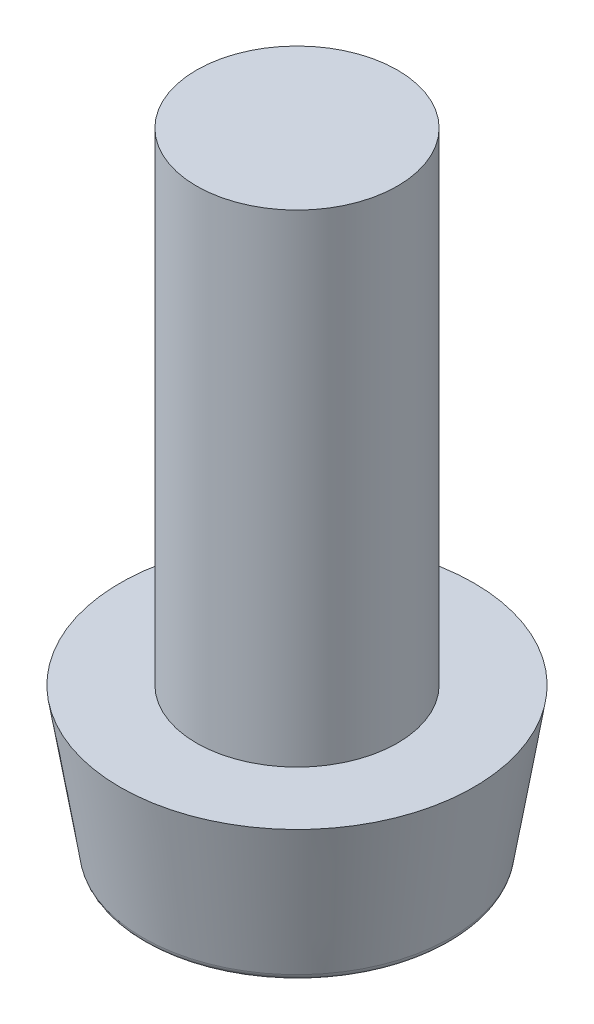
ISO-10303-21;
HEADER;
FILE_DESCRIPTION(('STEP AP214'),'2;1');
FILE_NAME('part.step','',(''),(''),'','','');
FILE_SCHEMA(('AUTOMOTIVE_DESIGN { 1 0 10303 214 1 1 1 1 }'));
ENDSEC;
DATA;
#1=APPLICATION_CONTEXT('core data for automotive mechanical design processes');
#2=APPLICATION_PROTOCOL_DEFINITION('international standard','automotive_design',2000,#1);
#3=PRODUCT_CONTEXT('',#1,'mechanical');
#4=PRODUCT('Part','Part','',(#3));
#5=PRODUCT_RELATED_PRODUCT_CATEGORY('part','',(#4));
#6=PRODUCT_DEFINITION_FORMATION('','',#4);
#7=PRODUCT_DEFINITION_CONTEXT('part definition',#1,'design');
#8=PRODUCT_DEFINITION('design','',#6,#7);
#9=PRODUCT_DEFINITION_SHAPE('','',#8);
#10=(LENGTH_UNIT() NAMED_UNIT(*) SI_UNIT(.MILLI.,.METRE.));
#11=(NAMED_UNIT(*) PLANE_ANGLE_UNIT() SI_UNIT($,.RADIAN.));
#12=(NAMED_UNIT(*) SI_UNIT($,.STERADIAN.) SOLID_ANGLE_UNIT());
#13=UNCERTAINTY_MEASURE_WITH_UNIT(LENGTH_MEASURE(1.E-05),#10,'distance_accuracy_value','');
#14=(GEOMETRIC_REPRESENTATION_CONTEXT(3) GLOBAL_UNCERTAINTY_ASSIGNED_CONTEXT((#13)) GLOBAL_UNIT_ASSIGNED_CONTEXT((#10,
#11,#12)) REPRESENTATION_CONTEXT('',''));
#15=CARTESIAN_POINT('',(0.,0.,0.));
#16=DIRECTION('',(0.,0.,1.));
#17=DIRECTION('',(1.,0.,0.));
#18=AXIS2_PLACEMENT_3D('',#15,#16,#17);
#19=CARTESIAN_POINT('',(0.,1.85,0.));
#20=DIRECTION('',(0.,1.,0.));
#21=DIRECTION('',(0.,0.,1.));
#22=AXIS2_PLACEMENT_3D('',#19,#20,#21);
#23=PLANE('',#22);
#24=CARTESIAN_POINT('',(0.,1.85,0.));
#25=DIRECTION('',(0.,1.,0.));
#26=DIRECTION('',(0.,0.,1.));
#27=AXIS2_PLACEMENT_3D('',#24,#25,#26);
#28=CIRCLE('',#27,1.25);
#29=CARTESIAN_POINT('',(0.,1.85,1.25));
#30=VERTEX_POINT('',#29);
#31=EDGE_CURVE('E50',#30,#30,#28,.T.);
#32=ORIENTED_EDGE('',*,*,#31,.F.);
#33=EDGE_LOOP('',(#32));
#34=FACE_BOUND('',#33,.T.);
#35=CARTESIAN_POINT('',(0.,1.85,0.));
#36=DIRECTION('',(0.,1.,0.));
#37=DIRECTION('',(0.,0.,1.));
#38=AXIS2_PLACEMENT_3D('',#35,#36,#37);
#39=CIRCLE('',#38,2.19999999999999);
#40=CARTESIAN_POINT('',(0.,1.85,2.19999999999999));
#41=VERTEX_POINT('',#40);
#42=EDGE_CURVE('E55',#41,#41,#39,.T.);
#43=ORIENTED_EDGE('',*,*,#42,.T.);
#44=EDGE_LOOP('',(#43));
#45=FACE_BOUND('',#44,.T.);
#46=ADVANCED_FACE('F37',(#34,#45),#23,.T.);
#47=CARTESIAN_POINT('',(0.,0.,0.));
#48=DIRECTION('',(0.,1.,0.));
#49=DIRECTION('',(0.,0.,1.));
#50=AXIS2_PLACEMENT_3D('',#47,#48,#49);
#51=PLANE('',#50);
#52=CARTESIAN_POINT('',(0.,0.,0.));
#53=DIRECTION('',(0.,1.,0.));
#54=DIRECTION('',(0.,0.,1.));
#55=AXIS2_PLACEMENT_3D('',#52,#53,#54);
#56=CIRCLE('',#55,1.81490991992437);
#57=CARTESIAN_POINT('',(0.,0.,1.81490991992437));
#58=VERTEX_POINT('',#57);
#59=EDGE_CURVE('E45',#58,#58,#56,.F.);
#60=ORIENTED_EDGE('',*,*,#59,.T.);
#61=EDGE_LOOP('',(#60));
#62=FACE_BOUND('',#61,.T.);
#63=ADVANCED_FACE('F71',(#62),#51,.F.);
#64=CARTESIAN_POINT('',(0.,7.85,0.));
#65=DIRECTION('',(0.,-1.,0.));
#66=DIRECTION('',(0.,0.,-1.));
#67=AXIS2_PLACEMENT_3D('',#64,#65,#66);
#68=CYLINDRICAL_SURFACE('',#67,1.25);
#69=CARTESIAN_POINT('',(0.,7.85,0.));
#70=DIRECTION('',(0.,1.,0.));
#71=DIRECTION('',(0.,0.,1.));
#72=AXIS2_PLACEMENT_3D('',#69,#70,#71);
#73=CIRCLE('',#72,1.25);
#74=CARTESIAN_POINT('',(0.,7.85,1.25));
#75=VERTEX_POINT('',#74);
#76=EDGE_CURVE('E60',#75,#75,#73,.T.);
#77=ORIENTED_EDGE('',*,*,#76,.F.);
#78=EDGE_LOOP('',(#77));
#79=FACE_BOUND('',#78,.T.);
#80=ORIENTED_EDGE('',*,*,#31,.T.);
#81=EDGE_LOOP('',(#80));
#82=FACE_BOUND('',#81,.T.);
#83=ADVANCED_FACE('F68',(#79,#82),#68,.T.);
#84=CARTESIAN_POINT('',(0.,7.85,0.));
#85=DIRECTION('',(0.,1.,0.));
#86=DIRECTION('',(0.,0.,1.));
#87=AXIS2_PLACEMENT_3D('',#84,#85,#86);
#88=PLANE('',#87);
#89=ORIENTED_EDGE('',*,*,#76,.T.);
#90=EDGE_LOOP('',(#89));
#91=FACE_BOUND('',#90,.T.);
#92=ADVANCED_FACE('F66',(#91),#88,.T.);
#93=CARTESIAN_POINT('',(0.,1.85000000000001,0.));
#94=DIRECTION('',(0.,1.,0.));
#95=DIRECTION('',(0.,0.,1.));
#96=AXIS2_PLACEMENT_3D('',#93,#94,#95);
#97=CONICAL_SURFACE('',#96,2.19999999999999,0.160762740625832);
#98=CARTESIAN_POINT('',(0.,0.0839928841446341,0.));
#99=DIRECTION('',(0.,1.,0.));
#100=DIRECTION('',(0.,0.,1.));
#101=AXIS2_PLACEMENT_3D('',#98,#99,#100);
#102=CIRCLE('',#101,1.91362046769913);
#103=CARTESIAN_POINT('',(0.,0.0839928841446342,1.91362046769913));
#104=VERTEX_POINT('',#103);
#105=EDGE_CURVE('E10',#104,#104,#102,.T.);
#106=CARTESIAN_POINT('',(0.,0.0839928841446342,1.91362046769913));
#107=CARTESIAN_POINT('',(0.,0.102388791601461,1.91660358782726));
#108=CARTESIAN_POINT('',(0.,0.120784699058288,1.91958670795539));
#109=CARTESIAN_POINT('',(0.,0.157576513971941,1.92555294821166));
#110=CARTESIAN_POINT('',(0.,0.175972421428768,1.9285360683398));
#111=CARTESIAN_POINT('',(0.,0.212764236342421,1.93450230859607));
#112=CARTESIAN_POINT('',(0.,0.231160143799248,1.9374854287242));
#113=CARTESIAN_POINT('',(0.,0.267951958712902,1.94345166898047));
#114=CARTESIAN_POINT('',(0.,0.286347866169728,1.9464347891086));
#115=CARTESIAN_POINT('',(0.,0.323139681083382,1.95240102936487));
#116=CARTESIAN_POINT('',(0.,0.341535588540208,1.955384149493));
#117=CARTESIAN_POINT('',(0.,0.378327403453862,1.96135038974927));
#118=CARTESIAN_POINT('',(0.,0.396723310910689,1.96433350987741));
#119=CARTESIAN_POINT('',(0.,0.433515125824342,1.97029975013367));
#120=CARTESIAN_POINT('',(0.,0.451911033281169,1.97328287026181));
#121=CARTESIAN_POINT('',(0.,0.488702848194822,1.97924911051807));
#122=CARTESIAN_POINT('',(0.,0.507098755651649,1.98223223064621));
#123=CARTESIAN_POINT('',(0.,0.543890570565302,1.98819847090248));
#124=CARTESIAN_POINT('',(0.,0.562286478022129,1.99118159103061));
#125=CARTESIAN_POINT('',(0.,0.599078292935783,1.99714783128688));
#126=CARTESIAN_POINT('',(0.,0.617474200392609,2.00013095141501));
#127=CARTESIAN_POINT('',(0.,0.654266015306263,2.00609719167128));
#128=CARTESIAN_POINT('',(0.,0.672661922763089,2.00908031179942));
#129=CARTESIAN_POINT('',(0.,0.709453737676743,2.01504655205568));
#130=CARTESIAN_POINT('',(0.,0.72784964513357,2.01802967218382));
#131=CARTESIAN_POINT('',(0.,0.764641460047223,2.02399591244009));
#132=CARTESIAN_POINT('',(0.,0.78303736750405,2.02697903256822));
#133=CARTESIAN_POINT('',(0.,0.819829182417703,2.03294527282449));
#134=CARTESIAN_POINT('',(0.,0.83822508987453,2.03592839295262));
#135=CARTESIAN_POINT('',(0.,0.875016904788184,2.04189463320889));
#136=CARTESIAN_POINT('',(0.,0.89341281224501,2.04487775333702));
#137=CARTESIAN_POINT('',(0.,0.930204627158664,2.05084399359329));
#138=CARTESIAN_POINT('',(0.,0.94860053461549,2.05382711372143));
#139=CARTESIAN_POINT('',(0.,0.985392349529144,2.05979335397769));
#140=CARTESIAN_POINT('',(0.,1.00378825698597,2.06277647410583));
#141=CARTESIAN_POINT('',(0.,1.04058007189962,2.0687427143621));
#142=CARTESIAN_POINT('',(0.,1.05897597935645,2.07172583449023));
#143=CARTESIAN_POINT('',(0.,1.0957677942701,2.0776920747465));
#144=CARTESIAN_POINT('',(0.,1.11416370172693,2.08067519487463));
#145=CARTESIAN_POINT('',(0.,1.15095551664058,2.0866414351309));
#146=CARTESIAN_POINT('',(0.,1.16935142409741,2.08962455525903));
#147=CARTESIAN_POINT('',(0.,1.20614323901106,2.0955907955153));
#148=CARTESIAN_POINT('',(0.,1.22453914646789,2.09857391564344));
#149=CARTESIAN_POINT('',(0.,1.26133096138154,2.1045401558997));
#150=CARTESIAN_POINT('',(0.,1.27972686883837,2.10752327602784));
#151=CARTESIAN_POINT('',(0.,1.31651868375202,2.11348951628411));
#152=CARTESIAN_POINT('',(0.,1.33491459120885,2.11647263641224));
#153=CARTESIAN_POINT('',(0.,1.3717064061225,2.12243887666851));
#154=CARTESIAN_POINT('',(0.,1.39010231357933,2.12542199679664));
#155=CARTESIAN_POINT('',(0.,1.42689412849299,2.13138823705291));
#156=CARTESIAN_POINT('',(0.,1.44529003594981,2.13437135718104));
#157=CARTESIAN_POINT('',(0.,1.48208185086347,2.14033759743731));
#158=CARTESIAN_POINT('',(0.,1.50047775832029,2.14332071756545));
#159=CARTESIAN_POINT('',(0.,1.53726957323395,2.14928695782171));
#160=CARTESIAN_POINT('',(0.,1.55566548069077,2.15227007794985));
#161=CARTESIAN_POINT('',(0.,1.59245729560443,2.15823631820612));
#162=CARTESIAN_POINT('',(0.,1.61085320306125,2.16121943833425));
#163=CARTESIAN_POINT('',(0.,1.64764501797491,2.16718567859052));
#164=CARTESIAN_POINT('',(0.,1.66604092543173,2.17016879871865));
#165=CARTESIAN_POINT('',(0.,1.70283274034539,2.17613503897492));
#166=CARTESIAN_POINT('',(0.,1.72122864780221,2.17911815910305));
#167=CARTESIAN_POINT('',(0.,1.75802046271587,2.18508439935932));
#168=CARTESIAN_POINT('',(0.,1.77641637017269,2.18806751948746));
#169=CARTESIAN_POINT('',(0.,1.81320818508635,2.19403375974372));
#170=CARTESIAN_POINT('',(0.,1.83160409254317,2.19701687987186));
#171=CARTESIAN_POINT('',(0.,1.85,2.19999999999999));
#172=B_SPLINE_CURVE_WITH_KNOTS('',3,(#106,#107,#108,#109,#110,#111,#112,#113,#114,#115,#116,
#117,#118,#119,#120,#121,#122,#123,#124,#125,#126,#127,#128,#129,#130,#131,#132,#133,#134,#135,
#136,#137,#138,#139,#140,#141,#142,#143,#144,#145,#146,#147,#148,#149,#150,#151,#152,#153,#154,
#155,#156,#157,#158,#159,#160,#161,#162,#163,#164,#165,#166,#167,#168,#169,#170,#171),
.UNSPECIFIED.,.F.,.F.,(4,2,2,2,2,2,2,2,2,2,2,2,2,2,2,2,2,2,2,2,2,2,2,2,2,2,2,2,2,2,2,2,4),(0.,
0.0559086375413595,0.111817275082719,0.167725912624078,0.223634550165438,0.279543187706797,
0.335451825248156,0.391360462789516,0.447269100330875,0.503177737872235,0.559086375413594,
0.614995012954954,0.670903650496313,0.726812288037673,0.782720925579032,0.838629563120391,
0.894538200661751,0.95044683820311,1.00635547574447,1.06226411328583,1.11817275082719,
1.17408138836855,1.22999002590991,1.28589866345127,1.34180730099263,1.39771593853399,
1.45362457607535,1.5095332136167,1.56544185115806,1.62135048869942,1.67725912624078,
1.73316776378214,1.7890764013235),.UNSPECIFIED.);
#173=EDGE_CURVE('BSEAM80',#104,#41,#172,.T.);
#174=ORIENTED_EDGE('',*,*,#105,.T.);
#175=ORIENTED_EDGE('',*,*,#42,.F.);
#176=ORIENTED_EDGE('',*,*,#173,.T.);
#177=ORIENTED_EDGE('',*,*,#173,.F.);
#178=EDGE_LOOP('',(#174,#176,#175,#177));
#179=FACE_BOUND('',#178,.T.);
#180=ADVANCED_FACE('F80',(#179),#97,.T.);
#181=CARTESIAN_POINT('',(0.,0.1,0.));
#182=DIRECTION('',(0.,1.,0.));
#183=DIRECTION('',(0.,0.,1.));
#184=AXIS2_PLACEMENT_3D('',#181,#182,#183);
#185=TOROIDAL_SURFACE('',#184,1.81490991992437,0.1);
#186=ORIENTED_EDGE('',*,*,#105,.F.);
#187=EDGE_LOOP('',(#186));
#188=FACE_BOUND('',#187,.T.);
#189=ORIENTED_EDGE('',*,*,#59,.F.);
#190=EDGE_LOOP('',(#189));
#191=FACE_BOUND('',#190,.T.);
#192=ADVANCED_FACE('F39',(#188,#191),#185,.T.);
#193=CLOSED_SHELL('',(#46,#63,#83,#92,#180,#192));
#194=MANIFOLD_SOLID_BREP('B2',#193);
#195=ADVANCED_BREP_SHAPE_REPRESENTATION('',(#18,#194),#14);
#196=SHAPE_DEFINITION_REPRESENTATION(#9,#195);
ENDSEC;
END-ISO-10303-21;
